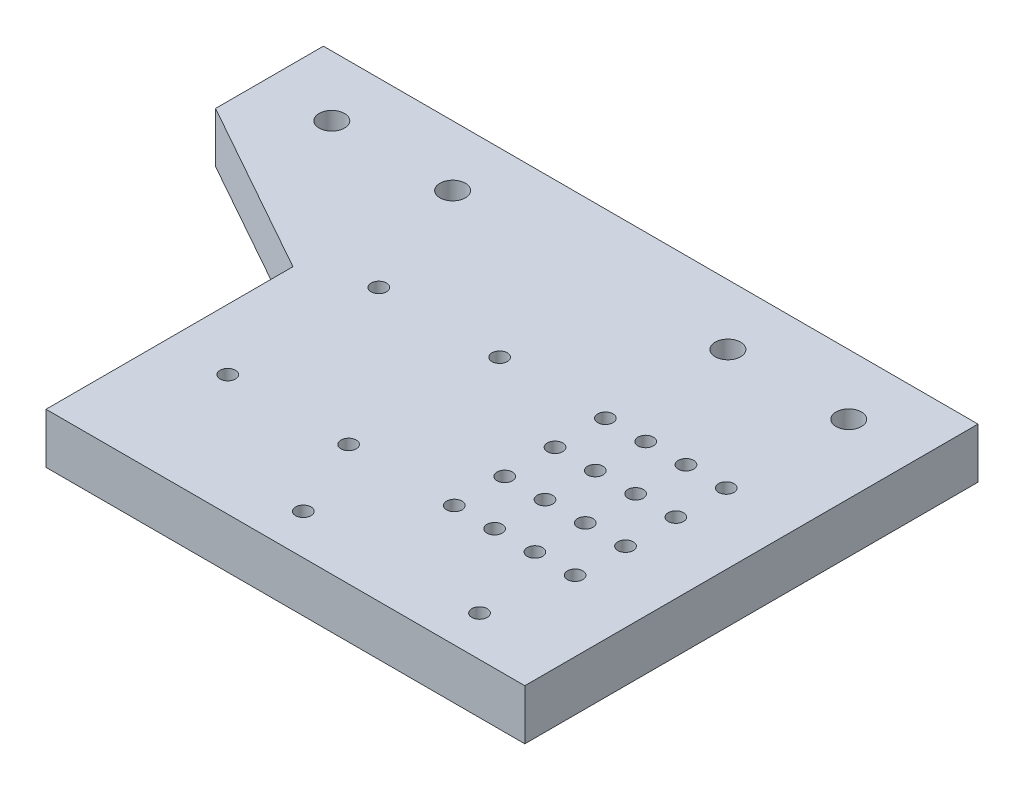
ISO-10303-21;
HEADER;
FILE_DESCRIPTION(('STEP AP214'),'2;1');
FILE_NAME('part.step','',(''),(''),'','','');
FILE_SCHEMA(('AUTOMOTIVE_DESIGN { 1 0 10303 214 1 1 1 1 }'));
ENDSEC;
DATA;
#1=APPLICATION_CONTEXT('core data for automotive mechanical design processes');
#2=APPLICATION_PROTOCOL_DEFINITION('international standard','automotive_design',2000,#1);
#3=PRODUCT_CONTEXT('',#1,'mechanical');
#4=PRODUCT('Part','Part','',(#3));
#5=PRODUCT_RELATED_PRODUCT_CATEGORY('part','',(#4));
#6=PRODUCT_DEFINITION_FORMATION('','',#4);
#7=PRODUCT_DEFINITION_CONTEXT('part definition',#1,'design');
#8=PRODUCT_DEFINITION('design','',#6,#7);
#9=PRODUCT_DEFINITION_SHAPE('','',#8);
#10=(LENGTH_UNIT() NAMED_UNIT(*) SI_UNIT(.MILLI.,.METRE.));
#11=(NAMED_UNIT(*) PLANE_ANGLE_UNIT() SI_UNIT($,.RADIAN.));
#12=(NAMED_UNIT(*) SI_UNIT($,.STERADIAN.) SOLID_ANGLE_UNIT());
#13=UNCERTAINTY_MEASURE_WITH_UNIT(LENGTH_MEASURE(1.E-05),#10,'distance_accuracy_value','');
#14=(GEOMETRIC_REPRESENTATION_CONTEXT(3) GLOBAL_UNCERTAINTY_ASSIGNED_CONTEXT((#13)) GLOBAL_UNIT_ASSIGNED_CONTEXT((#10,
#11,#12)) REPRESENTATION_CONTEXT('',''));
#15=CARTESIAN_POINT('',(0.,0.,0.));
#16=DIRECTION('',(0.,0.,1.));
#17=DIRECTION('',(1.,0.,0.));
#18=AXIS2_PLACEMENT_3D('',#15,#16,#17);
#19=CARTESIAN_POINT('',(0.,10.,17.2036231463069));
#20=DIRECTION('',(0.,0.,-1.));
#21=DIRECTION('',(-1.,0.,0.));
#22=AXIS2_PLACEMENT_3D('',#19,#20,#21);
#23=PLANE('',#22);
#24=DIRECTION('',(1.,0.,0.));
#25=VECTOR('',#24,1.);
#26=CARTESIAN_POINT('',(0.,0.,17.2036231463069));
#27=LINE('',#26,#25);
#28=CARTESIAN_POINT('',(-63.3580950062037,0.,17.2036231463069));
#29=VERTEX_POINT('',#28);
#30=CARTESIAN_POINT('',(31.7389236170605,0.,17.2036231463069));
#31=VERTEX_POINT('',#30);
#32=EDGE_CURVE('E223',#29,#31,#27,.T.);
#33=ORIENTED_EDGE('',*,*,#32,.T.);
#34=DIRECTION('',(0.,-1.,0.));
#35=VECTOR('',#34,1.);
#36=CARTESIAN_POINT('',(31.7389236170605,10.,17.2036231463069));
#37=LINE('',#36,#35);
#38=CARTESIAN_POINT('',(31.7389236170605,10.,17.2036231463069));
#39=VERTEX_POINT('',#38);
#40=EDGE_CURVE('E12',#39,#31,#37,.T.);
#41=ORIENTED_EDGE('',*,*,#40,.F.);
#42=DIRECTION('',(1.,0.,0.));
#43=VECTOR('',#42,1.);
#44=CARTESIAN_POINT('',(0.,10.,17.2036231463069));
#45=LINE('',#44,#43);
#46=CARTESIAN_POINT('',(-63.3580950062037,10.,17.2036231463069));
#47=VERTEX_POINT('',#46);
#48=EDGE_CURVE('E89',#47,#39,#45,.T.);
#49=ORIENTED_EDGE('',*,*,#48,.F.);
#50=DIRECTION('',(0.,-1.,0.));
#51=VECTOR('',#50,1.);
#52=CARTESIAN_POINT('',(-63.3580950062037,10.,17.2036231463069));
#53=LINE('',#52,#51);
#54=EDGE_CURVE('E168',#47,#29,#53,.T.);
#55=ORIENTED_EDGE('',*,*,#54,.T.);
#56=EDGE_LOOP('',(#33,#41,#49,#55));
#57=FACE_BOUND('',#56,.T.);
#58=ADVANCED_FACE('F38',(#57),#23,.F.);
#59=CARTESIAN_POINT('',(31.7389236170605,10.,0.));
#60=DIRECTION('',(1.,0.,0.));
#61=DIRECTION('',(0.,0.,-1.));
#62=AXIS2_PLACEMENT_3D('',#59,#60,#61);
#63=PLANE('',#62);
#64=DIRECTION('',(0.,0.,1.));
#65=VECTOR('',#64,1.);
#66=CARTESIAN_POINT('',(31.7389236170605,0.,0.));
#67=LINE('',#66,#65);
#68=CARTESIAN_POINT('',(31.7389236170605,0.,-72.7963768536931));
#69=VERTEX_POINT('',#68);
#70=EDGE_CURVE('E226',#69,#31,#67,.T.);
#71=ORIENTED_EDGE('',*,*,#70,.F.);
#72=DIRECTION('',(0.,-1.,0.));
#73=VECTOR('',#72,1.);
#74=CARTESIAN_POINT('',(31.7389236170605,10.,-72.7963768536931));
#75=LINE('',#74,#73);
#76=CARTESIAN_POINT('',(31.7389236170605,10.,-72.7963768536931));
#77=VERTEX_POINT('',#76);
#78=EDGE_CURVE('E47',#77,#69,#75,.T.);
#79=ORIENTED_EDGE('',*,*,#78,.F.);
#80=DIRECTION('',(0.,0.,1.));
#81=VECTOR('',#80,1.);
#82=CARTESIAN_POINT('',(31.7389236170605,10.,0.));
#83=LINE('',#82,#81);
#84=EDGE_CURVE('E862',#77,#39,#83,.T.);
#85=ORIENTED_EDGE('',*,*,#84,.T.);
#86=ORIENTED_EDGE('',*,*,#40,.T.);
#87=EDGE_LOOP('',(#71,#79,#85,#86));
#88=FACE_BOUND('',#87,.T.);
#89=ADVANCED_FACE('F268',(#88),#63,.T.);
#90=CARTESIAN_POINT('',(0.,10.,-72.7963768536931));
#91=DIRECTION('',(0.,0.,-1.));
#92=DIRECTION('',(-1.,0.,0.));
#93=AXIS2_PLACEMENT_3D('',#90,#91,#92);
#94=PLANE('',#93);
#95=DIRECTION('',(1.,0.,0.));
#96=VECTOR('',#95,1.);
#97=CARTESIAN_POINT('',(0.,0.,-72.7963768536931));
#98=LINE('',#97,#96);
#99=CARTESIAN_POINT('',(-98.2610763829395,0.,-72.7963768536931));
#100=VERTEX_POINT('',#99);
#101=EDGE_CURVE('E229',#100,#69,#98,.T.);
#102=ORIENTED_EDGE('',*,*,#101,.F.);
#103=DIRECTION('',(0.,-1.,0.));
#104=VECTOR('',#103,1.);
#105=CARTESIAN_POINT('',(-98.2610763829395,10.,-72.7963768536931));
#106=LINE('',#105,#104);
#107=CARTESIAN_POINT('',(-98.2610763829395,10.,-72.7963768536931));
#108=VERTEX_POINT('',#107);
#109=EDGE_CURVE('E114',#108,#100,#106,.T.);
#110=ORIENTED_EDGE('',*,*,#109,.F.);
#111=DIRECTION('',(1.,0.,0.));
#112=VECTOR('',#111,1.);
#113=CARTESIAN_POINT('',(0.,10.,-72.7963768536931));
#114=LINE('',#113,#112);
#115=EDGE_CURVE('E106',#108,#77,#114,.T.);
#116=ORIENTED_EDGE('',*,*,#115,.T.);
#117=ORIENTED_EDGE('',*,*,#78,.T.);
#118=EDGE_LOOP('',(#102,#110,#116,#117));
#119=FACE_BOUND('',#118,.T.);
#120=ADVANCED_FACE('F265',(#119),#94,.T.);
#121=CARTESIAN_POINT('',(-98.2610763829395,10.,0.));
#122=DIRECTION('',(1.,0.,0.));
#123=DIRECTION('',(0.,0.,-1.));
#124=AXIS2_PLACEMENT_3D('',#121,#122,#123);
#125=PLANE('',#124);
#126=DIRECTION('',(0.,0.,1.));
#127=VECTOR('',#126,1.);
#128=CARTESIAN_POINT('',(-98.2610763829395,0.,0.));
#129=LINE('',#128,#127);
#130=CARTESIAN_POINT('',(-98.2610763829395,0.,-51.3710297041461));
#131=VERTEX_POINT('',#130);
#132=EDGE_CURVE('E113',#100,#131,#129,.T.);
#133=ORIENTED_EDGE('',*,*,#132,.T.);
#134=DIRECTION('',(0.,-1.,0.));
#135=VECTOR('',#134,1.);
#136=CARTESIAN_POINT('',(-98.2610763829395,10.,-51.3710297041461));
#137=LINE('',#136,#135);
#138=CARTESIAN_POINT('',(-98.2610763829395,10.,-51.3710297041461));
#139=VERTEX_POINT('',#138);
#140=EDGE_CURVE('E110',#139,#131,#137,.T.);
#141=ORIENTED_EDGE('',*,*,#140,.F.);
#142=DIRECTION('',(0.,0.,1.));
#143=VECTOR('',#142,1.);
#144=CARTESIAN_POINT('',(-98.2610763829395,10.,0.));
#145=LINE('',#144,#143);
#146=EDGE_CURVE('E99',#108,#139,#145,.T.);
#147=ORIENTED_EDGE('',*,*,#146,.F.);
#148=ORIENTED_EDGE('',*,*,#109,.T.);
#149=EDGE_LOOP('',(#133,#141,#147,#148));
#150=FACE_BOUND('',#149,.T.);
#151=ADVANCED_FACE('F111',(#150),#125,.F.);
#152=CARTESIAN_POINT('',(-1.53993049672828,10.,2.75195190297999));
#153=DIRECTION('',(0.488322696033954,0.,-0.872663133481718));
#154=DIRECTION('',(-0.872663133481718,0.,-0.488322696033954));
#155=AXIS2_PLACEMENT_3D('',#152,#153,#154);
#156=PLANE('',#155);
#157=DIRECTION('',(0.872663133481718,0.,0.488322696033954));
#158=VECTOR('',#157,1.);
#159=CARTESIAN_POINT('',(-1.53993049672828,0.,2.75195190297999));
#160=LINE('',#159,#158);
#161=CARTESIAN_POINT('',(-63.3580950062037,0.,-31.8401049846506));
#162=VERTEX_POINT('',#161);
#163=EDGE_CURVE('E77',#131,#162,#160,.T.);
#164=ORIENTED_EDGE('',*,*,#163,.T.);
#165=DIRECTION('',(0.,-1.,0.));
#166=VECTOR('',#165,1.);
#167=CARTESIAN_POINT('',(-63.3580950062037,10.,-31.8401049846506));
#168=LINE('',#167,#166);
#169=CARTESIAN_POINT('',(-63.3580950062037,10.,-31.8401049846506));
#170=VERTEX_POINT('',#169);
#171=EDGE_CURVE('E115',#170,#162,#168,.T.);
#172=ORIENTED_EDGE('',*,*,#171,.F.);
#173=DIRECTION('',(0.872663133481718,0.,0.488322696033954));
#174=VECTOR('',#173,1.);
#175=CARTESIAN_POINT('',(-1.53993049672828,10.,2.75195190297999));
#176=LINE('',#175,#174);
#177=EDGE_CURVE('E104',#139,#170,#176,.T.);
#178=ORIENTED_EDGE('',*,*,#177,.F.);
#179=ORIENTED_EDGE('',*,*,#140,.T.);
#180=EDGE_LOOP('',(#164,#172,#178,#179));
#181=FACE_BOUND('',#180,.T.);
#182=ADVANCED_FACE('F117',(#181),#156,.F.);
#183=CARTESIAN_POINT('',(9.7365771203231,10.,-16.7963768536931));
#184=DIRECTION('',(0.,-1.,0.));
#185=DIRECTION('',(0.,0.,-1.));
#186=AXIS2_PLACEMENT_3D('',#183,#184,#185);
#187=CYLINDRICAL_SURFACE('',#186,1.525);
#188=CARTESIAN_POINT('',(9.7365771203231,10.,-16.7963768536931));
#189=DIRECTION('',(0.,1.,0.));
#190=DIRECTION('',(0.,0.,1.));
#191=AXIS2_PLACEMENT_3D('',#188,#189,#190);
#192=CIRCLE('',#191,1.525);
#193=CARTESIAN_POINT('',(9.7365771203231,10.,-15.2713768536931));
#194=VERTEX_POINT('',#193);
#195=EDGE_CURVE('E160',#194,#194,#192,.F.);
#196=ORIENTED_EDGE('',*,*,#195,.F.);
#197=EDGE_LOOP('',(#196));
#198=FACE_BOUND('',#197,.T.);
#199=CARTESIAN_POINT('',(9.7365771203231,0.,-16.7963768536931));
#200=DIRECTION('',(0.,1.,0.));
#201=DIRECTION('',(0.,0.,1.));
#202=AXIS2_PLACEMENT_3D('',#199,#200,#201);
#203=CIRCLE('',#202,1.525);
#204=CARTESIAN_POINT('',(9.7365771203231,0.,-15.2713768536931));
#205=VERTEX_POINT('',#204);
#206=EDGE_CURVE('E253',#205,#205,#203,.F.);
#207=ORIENTED_EDGE('',*,*,#206,.T.);
#208=EDGE_LOOP('',(#207));
#209=FACE_BOUND('',#208,.T.);
#210=ADVANCED_FACE('F430',(#198,#209),#187,.F.);
#211=CARTESIAN_POINT('',(17.7389236170605,10.,-36.7963768536931));
#212=DIRECTION('',(0.,-1.,0.));
#213=DIRECTION('',(0.,0.,-1.));
#214=AXIS2_PLACEMENT_3D('',#211,#212,#213);
#215=CYLINDRICAL_SURFACE('',#214,1.525);
#216=CARTESIAN_POINT('',(17.7389236170605,10.,-36.7963768536931));
#217=DIRECTION('',(0.,1.,0.));
#218=DIRECTION('',(0.,0.,1.));
#219=AXIS2_PLACEMENT_3D('',#216,#217,#218);
#220=CIRCLE('',#219,1.525);
#221=CARTESIAN_POINT('',(17.7389236170605,10.,-35.2713768536931));
#222=VERTEX_POINT('',#221);
#223=EDGE_CURVE('E155',#222,#222,#220,.T.);
#224=ORIENTED_EDGE('',*,*,#223,.T.);
#225=EDGE_LOOP('',(#224));
#226=FACE_BOUND('',#225,.T.);
#227=CARTESIAN_POINT('',(17.7389236170605,0.,-36.7963768536931));
#228=DIRECTION('',(0.,1.,0.));
#229=DIRECTION('',(0.,0.,1.));
#230=AXIS2_PLACEMENT_3D('',#227,#228,#229);
#231=CIRCLE('',#230,1.525);
#232=CARTESIAN_POINT('',(17.7389236170605,0.,-35.2713768536931));
#233=VERTEX_POINT('',#232);
#234=EDGE_CURVE('E250',#233,#233,#231,.T.);
#235=ORIENTED_EDGE('',*,*,#234,.F.);
#236=EDGE_LOOP('',(#235));
#237=FACE_BOUND('',#236,.T.);
#238=ADVANCED_FACE('F433',(#226,#237),#215,.F.);
#239=CARTESIAN_POINT('',(-60.5943040819661,10.,-60.7963768536931));
#240=DIRECTION('',(0.,-1.,0.));
#241=DIRECTION('',(0.,0.,-1.));
#242=AXIS2_PLACEMENT_3D('',#239,#240,#241);
#243=CYLINDRICAL_SURFACE('',#242,2.525);
#244=CARTESIAN_POINT('',(-60.5943040819661,10.,-60.7963768536931));
#245=DIRECTION('',(0.,1.,0.));
#246=DIRECTION('',(0.,0.,1.));
#247=AXIS2_PLACEMENT_3D('',#244,#245,#246);
#248=CIRCLE('',#247,2.525);
#249=CARTESIAN_POINT('',(-60.5943040819661,10.,-58.2713768536931));
#250=VERTEX_POINT('',#249);
#251=EDGE_CURVE('E152',#250,#250,#248,.F.);
#252=ORIENTED_EDGE('',*,*,#251,.F.);
#253=EDGE_LOOP('',(#252));
#254=FACE_BOUND('',#253,.T.);
#255=CARTESIAN_POINT('',(-60.5943040819661,0.,-60.7963768536931));
#256=DIRECTION('',(0.,1.,0.));
#257=DIRECTION('',(0.,0.,1.));
#258=AXIS2_PLACEMENT_3D('',#255,#256,#257);
#259=CIRCLE('',#258,2.525);
#260=CARTESIAN_POINT('',(-60.5943040819661,0.,-58.2713768536931));
#261=VERTEX_POINT('',#260);
#262=EDGE_CURVE('E247',#261,#261,#259,.F.);
#263=ORIENTED_EDGE('',*,*,#262,.T.);
#264=EDGE_LOOP('',(#263));
#265=FACE_BOUND('',#264,.T.);
#266=ADVANCED_FACE('F437',(#254,#265),#243,.F.);
#267=CARTESIAN_POINT('',(-84.5943040819661,10.,-60.7963768536931));
#268=DIRECTION('',(0.,-1.,0.));
#269=DIRECTION('',(0.,0.,-1.));
#270=AXIS2_PLACEMENT_3D('',#267,#268,#269);
#271=CYLINDRICAL_SURFACE('',#270,2.52500000000001);
#272=CARTESIAN_POINT('',(-84.5943040819661,10.,-60.7963768536931));
#273=DIRECTION('',(0.,1.,0.));
#274=DIRECTION('',(0.,0.,1.));
#275=AXIS2_PLACEMENT_3D('',#272,#273,#274);
#276=CIRCLE('',#275,2.52500000000001);
#277=CARTESIAN_POINT('',(-84.5943040819661,10.,-58.2713768536931));
#278=VERTEX_POINT('',#277);
#279=EDGE_CURVE('E148',#278,#278,#276,.F.);
#280=ORIENTED_EDGE('',*,*,#279,.F.);
#281=EDGE_LOOP('',(#280));
#282=FACE_BOUND('',#281,.T.);
#283=CARTESIAN_POINT('',(-84.5943040819661,0.,-60.7963768536931));
#284=DIRECTION('',(0.,1.,0.));
#285=DIRECTION('',(0.,0.,1.));
#286=AXIS2_PLACEMENT_3D('',#283,#284,#285);
#287=CIRCLE('',#286,2.52500000000001);
#288=CARTESIAN_POINT('',(-84.5943040819661,0.,-58.2713768536931));
#289=VERTEX_POINT('',#288);
#290=EDGE_CURVE('E244',#289,#289,#287,.F.);
#291=ORIENTED_EDGE('',*,*,#290,.T.);
#292=EDGE_LOOP('',(#291));
#293=FACE_BOUND('',#292,.T.);
#294=ADVANCED_FACE('F441',(#282,#293),#271,.F.);
#295=CARTESIAN_POINT('',(-51.2610763829395,10.,-36.7963768536931));
#296=DIRECTION('',(0.,-1.,0.));
#297=DIRECTION('',(0.,0.,-1.));
#298=AXIS2_PLACEMENT_3D('',#295,#296,#297);
#299=CYLINDRICAL_SURFACE('',#298,1.525);
#300=CARTESIAN_POINT('',(-51.2610763829395,10.,-36.7963768536931));
#301=DIRECTION('',(0.,1.,0.));
#302=DIRECTION('',(0.,0.,1.));
#303=AXIS2_PLACEMENT_3D('',#300,#301,#302);
#304=CIRCLE('',#303,1.525);
#305=CARTESIAN_POINT('',(-51.2610763829395,10.,-35.2713768536931));
#306=VERTEX_POINT('',#305);
#307=EDGE_CURVE('E143',#306,#306,#304,.T.);
#308=ORIENTED_EDGE('',*,*,#307,.T.);
#309=EDGE_LOOP('',(#308));
#310=FACE_BOUND('',#309,.T.);
#311=CARTESIAN_POINT('',(-51.2610763829395,0.,-36.7963768536931));
#312=DIRECTION('',(0.,1.,0.));
#313=DIRECTION('',(0.,0.,1.));
#314=AXIS2_PLACEMENT_3D('',#311,#312,#313);
#315=CIRCLE('',#314,1.525);
#316=CARTESIAN_POINT('',(-51.2610763829395,0.,-35.2713768536931));
#317=VERTEX_POINT('',#316);
#318=EDGE_CURVE('E241',#317,#317,#315,.T.);
#319=ORIENTED_EDGE('',*,*,#318,.F.);
#320=EDGE_LOOP('',(#319));
#321=FACE_BOUND('',#320,.T.);
#322=ADVANCED_FACE('F445',(#310,#321),#299,.F.);
#323=CARTESIAN_POINT('',(-20.2610763829395,10.,9.20362314630692));
#324=DIRECTION('',(0.,-1.,0.));
#325=DIRECTION('',(0.,0.,-1.));
#326=AXIS2_PLACEMENT_3D('',#323,#324,#325);
#327=CYLINDRICAL_SURFACE('',#326,1.525);
#328=CARTESIAN_POINT('',(-20.2610763829395,10.,9.20362314630692));
#329=DIRECTION('',(0.,1.,0.));
#330=DIRECTION('',(0.,0.,1.));
#331=AXIS2_PLACEMENT_3D('',#328,#329,#330);
#332=CIRCLE('',#331,1.525);
#333=CARTESIAN_POINT('',(-20.2610763829395,10.,10.7286231463069));
#334=VERTEX_POINT('',#333);
#335=EDGE_CURVE('E138',#334,#334,#332,.T.);
#336=ORIENTED_EDGE('',*,*,#335,.T.);
#337=EDGE_LOOP('',(#336));
#338=FACE_BOUND('',#337,.T.);
#339=CARTESIAN_POINT('',(-20.2610763829395,0.,9.20362314630692));
#340=DIRECTION('',(0.,1.,0.));
#341=DIRECTION('',(0.,0.,1.));
#342=AXIS2_PLACEMENT_3D('',#339,#340,#341);
#343=CIRCLE('',#342,1.525);
#344=CARTESIAN_POINT('',(-20.2610763829395,0.,10.7286231463069));
#345=VERTEX_POINT('',#344);
#346=EDGE_CURVE('E238',#345,#345,#343,.T.);
#347=ORIENTED_EDGE('',*,*,#346,.F.);
#348=EDGE_LOOP('',(#347));
#349=FACE_BOUND('',#348,.T.);
#350=ADVANCED_FACE('F286',(#338,#349),#327,.F.);
#351=CARTESIAN_POINT('',(-5.927848683913,10.,-60.7963768536931));
#352=DIRECTION('',(0.,-1.,0.));
#353=DIRECTION('',(0.,0.,-1.));
#354=AXIS2_PLACEMENT_3D('',#351,#352,#353);
#355=CYLINDRICAL_SURFACE('',#354,2.525);
#356=CARTESIAN_POINT('',(-5.927848683913,10.,-60.7963768536931));
#357=DIRECTION('',(0.,1.,0.));
#358=DIRECTION('',(0.,0.,1.));
#359=AXIS2_PLACEMENT_3D('',#356,#357,#358);
#360=CIRCLE('',#359,2.525);
#361=CARTESIAN_POINT('',(-5.927848683913,10.,-58.2713768536931));
#362=VERTEX_POINT('',#361);
#363=EDGE_CURVE('E121',#362,#362,#360,.T.);
#364=ORIENTED_EDGE('',*,*,#363,.T.);
#365=EDGE_LOOP('',(#364));
#366=FACE_BOUND('',#365,.T.);
#367=CARTESIAN_POINT('',(-5.927848683913,0.,-60.7963768536931));
#368=DIRECTION('',(0.,1.,0.));
#369=DIRECTION('',(0.,0.,1.));
#370=AXIS2_PLACEMENT_3D('',#367,#368,#369);
#371=CIRCLE('',#370,2.525);
#372=CARTESIAN_POINT('',(-5.927848683913,0.,-58.2713768536931));
#373=VERTEX_POINT('',#372);
#374=EDGE_CURVE('E235',#373,#373,#371,.T.);
#375=ORIENTED_EDGE('',*,*,#374,.F.);
#376=EDGE_LOOP('',(#375));
#377=FACE_BOUND('',#376,.T.);
#378=ADVANCED_FACE('F277',(#366,#377),#355,.F.);
#379=CARTESIAN_POINT('',(-63.3580950062037,10.,0.));
#380=DIRECTION('',(1.,0.,0.));
#381=DIRECTION('',(0.,0.,-1.));
#382=AXIS2_PLACEMENT_3D('',#379,#380,#381);
#383=PLANE('',#382);
#384=DIRECTION('',(0.,0.,1.));
#385=VECTOR('',#384,1.);
#386=CARTESIAN_POINT('',(-63.3580950062037,0.,0.));
#387=LINE('',#386,#385);
#388=EDGE_CURVE('E83',#162,#29,#387,.T.);
#389=ORIENTED_EDGE('',*,*,#388,.T.);
#390=ORIENTED_EDGE('',*,*,#54,.F.);
#391=DIRECTION('',(0.,0.,1.));
#392=VECTOR('',#391,1.);
#393=CARTESIAN_POINT('',(-63.3580950062037,10.,0.));
#394=LINE('',#393,#392);
#395=EDGE_CURVE('E55',#170,#47,#394,.T.);
#396=ORIENTED_EDGE('',*,*,#395,.F.);
#397=ORIENTED_EDGE('',*,*,#171,.T.);
#398=EDGE_LOOP('',(#389,#390,#396,#397));
#399=FACE_BOUND('',#398,.T.);
#400=ADVANCED_FACE('F274',(#399),#383,.F.);
#401=CARTESIAN_POINT('',(-51.2610763829395,10.,-6.79637685369309));
#402=DIRECTION('',(0.,-1.,0.));
#403=DIRECTION('',(0.,0.,-1.));
#404=AXIS2_PLACEMENT_3D('',#401,#402,#403);
#405=CYLINDRICAL_SURFACE('',#404,1.525);
#406=CARTESIAN_POINT('',(-51.2610763829395,10.,-6.79637685369309));
#407=DIRECTION('',(0.,1.,0.));
#408=DIRECTION('',(0.,0.,1.));
#409=AXIS2_PLACEMENT_3D('',#406,#407,#408);
#410=CIRCLE('',#409,1.525);
#411=CARTESIAN_POINT('',(-51.2610763829395,10.,-5.27137685369309));
#412=VERTEX_POINT('',#411);
#413=EDGE_CURVE('E857',#412,#412,#410,.T.);
#414=ORIENTED_EDGE('',*,*,#413,.T.);
#415=EDGE_LOOP('',(#414));
#416=FACE_BOUND('',#415,.T.);
#417=CARTESIAN_POINT('',(-51.2610763829395,0.,-6.79637685369309));
#418=DIRECTION('',(0.,1.,0.));
#419=DIRECTION('',(0.,0.,1.));
#420=AXIS2_PLACEMENT_3D('',#417,#418,#419);
#421=CIRCLE('',#420,1.525);
#422=CARTESIAN_POINT('',(-51.2610763829395,0.,-5.27137685369309));
#423=VERTEX_POINT('',#422);
#424=EDGE_CURVE('E220',#423,#423,#421,.T.);
#425=ORIENTED_EDGE('',*,*,#424,.F.);
#426=EDGE_LOOP('',(#425));
#427=FACE_BOUND('',#426,.T.);
#428=ADVANCED_FACE('F276',(#416,#427),#405,.F.);
#429=CARTESIAN_POINT('',(-27.2610763829395,10.,-36.7963768536931));
#430=DIRECTION('',(0.,-1.,0.));
#431=DIRECTION('',(0.,0.,-1.));
#432=AXIS2_PLACEMENT_3D('',#429,#430,#431);
#433=CYLINDRICAL_SURFACE('',#432,1.52499999999999);
#434=CARTESIAN_POINT('',(-27.2610763829395,10.,-36.7963768536931));
#435=DIRECTION('',(0.,1.,0.));
#436=DIRECTION('',(0.,0.,1.));
#437=AXIS2_PLACEMENT_3D('',#434,#435,#436);
#438=CIRCLE('',#437,1.52499999999999);
#439=CARTESIAN_POINT('',(-27.2610763829395,10.,-35.2713768536931));
#440=VERTEX_POINT('',#439);
#441=EDGE_CURVE('E854',#440,#440,#438,.F.);
#442=ORIENTED_EDGE('',*,*,#441,.F.);
#443=EDGE_LOOP('',(#442));
#444=FACE_BOUND('',#443,.T.);
#445=CARTESIAN_POINT('',(-27.2610763829395,0.,-36.7963768536931));
#446=DIRECTION('',(0.,1.,0.));
#447=DIRECTION('',(0.,0.,1.));
#448=AXIS2_PLACEMENT_3D('',#445,#446,#447);
#449=CIRCLE('',#448,1.52499999999999);
#450=CARTESIAN_POINT('',(-27.2610763829395,0.,-35.2713768536931));
#451=VERTEX_POINT('',#450);
#452=EDGE_CURVE('E217',#451,#451,#449,.F.);
#453=ORIENTED_EDGE('',*,*,#452,.T.);
#454=EDGE_LOOP('',(#453));
#455=FACE_BOUND('',#454,.T.);
#456=ADVANCED_FACE('F283',(#444,#455),#433,.F.);
#457=CARTESIAN_POINT('',(-27.2610763829395,10.,-6.79637685369309));
#458=DIRECTION('',(0.,-1.,0.));
#459=DIRECTION('',(0.,0.,-1.));
#460=AXIS2_PLACEMENT_3D('',#457,#458,#459);
#461=CYLINDRICAL_SURFACE('',#460,1.525);
#462=CARTESIAN_POINT('',(-27.2610763829395,10.,-6.79637685369309));
#463=DIRECTION('',(0.,1.,0.));
#464=DIRECTION('',(0.,0.,1.));
#465=AXIS2_PLACEMENT_3D('',#462,#463,#464);
#466=CIRCLE('',#465,1.525);
#467=CARTESIAN_POINT('',(-27.2610763829395,10.,-5.27137685369309));
#468=VERTEX_POINT('',#467);
#469=EDGE_CURVE('E850',#468,#468,#466,.F.);
#470=ORIENTED_EDGE('',*,*,#469,.F.);
#471=EDGE_LOOP('',(#470));
#472=FACE_BOUND('',#471,.T.);
#473=CARTESIAN_POINT('',(-27.2610763829395,0.,-6.79637685369309));
#474=DIRECTION('',(0.,1.,0.));
#475=DIRECTION('',(0.,0.,1.));
#476=AXIS2_PLACEMENT_3D('',#473,#474,#475);
#477=CIRCLE('',#476,1.525);
#478=CARTESIAN_POINT('',(-27.2610763829395,0.,-5.27137685369309));
#479=VERTEX_POINT('',#478);
#480=EDGE_CURVE('E214',#479,#479,#477,.F.);
#481=ORIENTED_EDGE('',*,*,#480,.T.);
#482=EDGE_LOOP('',(#481));
#483=FACE_BOUND('',#482,.T.);
#484=ADVANCED_FACE('F300',(#472,#483),#461,.F.);
#485=CARTESIAN_POINT('',(-6.26107638293954,10.,-36.7963768536931));
#486=DIRECTION('',(0.,-1.,0.));
#487=DIRECTION('',(0.,0.,-1.));
#488=AXIS2_PLACEMENT_3D('',#485,#486,#487);
#489=CYLINDRICAL_SURFACE('',#488,1.525);
#490=CARTESIAN_POINT('',(-6.26107638293954,10.,-36.7963768536931));
#491=DIRECTION('',(0.,1.,0.));
#492=DIRECTION('',(0.,0.,1.));
#493=AXIS2_PLACEMENT_3D('',#490,#491,#492);
#494=CIRCLE('',#493,1.525);
#495=CARTESIAN_POINT('',(-6.26107638293954,10.,-35.2713768536931));
#496=VERTEX_POINT('',#495);
#497=EDGE_CURVE('E846',#496,#496,#494,.T.);
#498=ORIENTED_EDGE('',*,*,#497,.T.);
#499=EDGE_LOOP('',(#498));
#500=FACE_BOUND('',#499,.T.);
#501=CARTESIAN_POINT('',(-6.26107638293954,0.,-36.7963768536931));
#502=DIRECTION('',(0.,1.,0.));
#503=DIRECTION('',(0.,0.,1.));
#504=AXIS2_PLACEMENT_3D('',#501,#502,#503);
#505=CIRCLE('',#504,1.525);
#506=CARTESIAN_POINT('',(-6.26107638293954,0.,-35.2713768536931));
#507=VERTEX_POINT('',#506);
#508=EDGE_CURVE('E211',#507,#507,#505,.T.);
#509=ORIENTED_EDGE('',*,*,#508,.F.);
#510=EDGE_LOOP('',(#509));
#511=FACE_BOUND('',#510,.T.);
#512=ADVANCED_FACE('F304',(#500,#511),#489,.F.);
#513=CARTESIAN_POINT('',(-6.26107638293954,10.,-16.7963768536931));
#514=DIRECTION('',(0.,-1.,0.));
#515=DIRECTION('',(0.,0.,-1.));
#516=AXIS2_PLACEMENT_3D('',#513,#514,#515);
#517=CYLINDRICAL_SURFACE('',#516,1.525);
#518=CARTESIAN_POINT('',(-6.26107638293954,10.,-16.7963768536931));
#519=DIRECTION('',(0.,1.,0.));
#520=DIRECTION('',(0.,0.,1.));
#521=AXIS2_PLACEMENT_3D('',#518,#519,#520);
#522=CIRCLE('',#521,1.525);
#523=CARTESIAN_POINT('',(-6.26107638293954,10.,-15.2713768536931));
#524=VERTEX_POINT('',#523);
#525=EDGE_CURVE('E842',#524,#524,#522,.T.);
#526=ORIENTED_EDGE('',*,*,#525,.T.);
#527=EDGE_LOOP('',(#526));
#528=FACE_BOUND('',#527,.T.);
#529=CARTESIAN_POINT('',(-6.26107638293954,0.,-16.7963768536931));
#530=DIRECTION('',(0.,1.,0.));
#531=DIRECTION('',(0.,0.,1.));
#532=AXIS2_PLACEMENT_3D('',#529,#530,#531);
#533=CIRCLE('',#532,1.525);
#534=CARTESIAN_POINT('',(-6.26107638293954,0.,-15.2713768536931));
#535=VERTEX_POINT('',#534);
#536=EDGE_CURVE('E208',#535,#535,#533,.T.);
#537=ORIENTED_EDGE('',*,*,#536,.F.);
#538=EDGE_LOOP('',(#537));
#539=FACE_BOUND('',#538,.T.);
#540=ADVANCED_FACE('F308',(#528,#539),#517,.F.);
#541=CARTESIAN_POINT('',(-6.26107638293954,10.,-6.79637685369309));
#542=DIRECTION('',(0.,-1.,0.));
#543=DIRECTION('',(0.,0.,-1.));
#544=AXIS2_PLACEMENT_3D('',#541,#542,#543);
#545=CYLINDRICAL_SURFACE('',#544,1.525);
#546=CARTESIAN_POINT('',(-6.26107638293954,10.,-6.79637685369309));
#547=DIRECTION('',(0.,1.,0.));
#548=DIRECTION('',(0.,0.,1.));
#549=AXIS2_PLACEMENT_3D('',#546,#547,#548);
#550=CIRCLE('',#549,1.525);
#551=CARTESIAN_POINT('',(-6.26107638293954,10.,-5.27137685369308));
#552=VERTEX_POINT('',#551);
#553=EDGE_CURVE('E838',#552,#552,#550,.T.);
#554=ORIENTED_EDGE('',*,*,#553,.T.);
#555=EDGE_LOOP('',(#554));
#556=FACE_BOUND('',#555,.T.);
#557=CARTESIAN_POINT('',(-6.26107638293954,0.,-6.79637685369309));
#558=DIRECTION('',(0.,1.,0.));
#559=DIRECTION('',(0.,0.,1.));
#560=AXIS2_PLACEMENT_3D('',#557,#558,#559);
#561=CIRCLE('',#560,1.525);
#562=CARTESIAN_POINT('',(-6.26107638293954,0.,-5.27137685369308));
#563=VERTEX_POINT('',#562);
#564=EDGE_CURVE('E205',#563,#563,#561,.T.);
#565=ORIENTED_EDGE('',*,*,#564,.F.);
#566=EDGE_LOOP('',(#565));
#567=FACE_BOUND('',#566,.T.);
#568=ADVANCED_FACE('F312',(#556,#567),#545,.F.);
#569=CARTESIAN_POINT('',(1.7365771203231,10.,-6.79637685369308));
#570=DIRECTION('',(0.,-1.,0.));
#571=DIRECTION('',(0.,0.,-1.));
#572=AXIS2_PLACEMENT_3D('',#569,#570,#571);
#573=CYLINDRICAL_SURFACE('',#572,1.525);
#574=CARTESIAN_POINT('',(1.7365771203231,10.,-6.79637685369308));
#575=DIRECTION('',(0.,1.,0.));
#576=DIRECTION('',(0.,0.,1.));
#577=AXIS2_PLACEMENT_3D('',#574,#575,#576);
#578=CIRCLE('',#577,1.525);
#579=CARTESIAN_POINT('',(1.7365771203231,10.,-5.27137685369309));
#580=VERTEX_POINT('',#579);
#581=EDGE_CURVE('E834',#580,#580,#578,.F.);
#582=ORIENTED_EDGE('',*,*,#581,.F.);
#583=EDGE_LOOP('',(#582));
#584=FACE_BOUND('',#583,.T.);
#585=CARTESIAN_POINT('',(1.7365771203231,0.,-6.79637685369308));
#586=DIRECTION('',(0.,1.,0.));
#587=DIRECTION('',(0.,0.,1.));
#588=AXIS2_PLACEMENT_3D('',#585,#586,#587);
#589=CIRCLE('',#588,1.525);
#590=CARTESIAN_POINT('',(1.7365771203231,0.,-5.27137685369309));
#591=VERTEX_POINT('',#590);
#592=EDGE_CURVE('E202',#591,#591,#589,.F.);
#593=ORIENTED_EDGE('',*,*,#592,.T.);
#594=EDGE_LOOP('',(#593));
#595=FACE_BOUND('',#594,.T.);
#596=ADVANCED_FACE('F316',(#584,#595),#573,.F.);
#597=CARTESIAN_POINT('',(9.73657712032309,10.,-6.79637685369309));
#598=DIRECTION('',(0.,-1.,0.));
#599=DIRECTION('',(0.,0.,-1.));
#600=AXIS2_PLACEMENT_3D('',#597,#598,#599);
#601=CYLINDRICAL_SURFACE('',#600,1.525);
#602=CARTESIAN_POINT('',(9.73657712032309,10.,-6.79637685369309));
#603=DIRECTION('',(0.,1.,0.));
#604=DIRECTION('',(0.,0.,1.));
#605=AXIS2_PLACEMENT_3D('',#602,#603,#604);
#606=CIRCLE('',#605,1.525);
#607=CARTESIAN_POINT('',(9.73657712032309,10.,-5.27137685369309));
#608=VERTEX_POINT('',#607);
#609=EDGE_CURVE('E830',#608,#608,#606,.F.);
#610=ORIENTED_EDGE('',*,*,#609,.F.);
#611=EDGE_LOOP('',(#610));
#612=FACE_BOUND('',#611,.T.);
#613=CARTESIAN_POINT('',(9.73657712032309,0.,-6.79637685369309));
#614=DIRECTION('',(0.,1.,0.));
#615=DIRECTION('',(0.,0.,1.));
#616=AXIS2_PLACEMENT_3D('',#613,#614,#615);
#617=CIRCLE('',#616,1.525);
#618=CARTESIAN_POINT('',(9.73657712032309,0.,-5.27137685369309));
#619=VERTEX_POINT('',#618);
#620=EDGE_CURVE('E199',#619,#619,#617,.F.);
#621=ORIENTED_EDGE('',*,*,#620,.T.);
#622=EDGE_LOOP('',(#621));
#623=FACE_BOUND('',#622,.T.);
#624=ADVANCED_FACE('F320',(#612,#623),#601,.F.);
#625=CARTESIAN_POINT('',(14.7389236170605,10.,9.20362314630692));
#626=DIRECTION('',(0.,-1.,0.));
#627=DIRECTION('',(0.,0.,-1.));
#628=AXIS2_PLACEMENT_3D('',#625,#626,#627);
#629=CYLINDRICAL_SURFACE('',#628,1.525);
#630=CARTESIAN_POINT('',(14.7389236170605,10.,9.20362314630692));
#631=DIRECTION('',(0.,1.,0.));
#632=DIRECTION('',(0.,0.,1.));
#633=AXIS2_PLACEMENT_3D('',#630,#631,#632);
#634=CIRCLE('',#633,1.525);
#635=CARTESIAN_POINT('',(14.7389236170605,10.,10.7286231463069));
#636=VERTEX_POINT('',#635);
#637=EDGE_CURVE('E826',#636,#636,#634,.T.);
#638=ORIENTED_EDGE('',*,*,#637,.T.);
#639=EDGE_LOOP('',(#638));
#640=FACE_BOUND('',#639,.T.);
#641=CARTESIAN_POINT('',(14.7389236170605,0.,9.20362314630692));
#642=DIRECTION('',(0.,1.,0.));
#643=DIRECTION('',(0.,0.,1.));
#644=AXIS2_PLACEMENT_3D('',#641,#642,#643);
#645=CIRCLE('',#644,1.525);
#646=CARTESIAN_POINT('',(14.7389236170605,0.,10.7286231463069));
#647=VERTEX_POINT('',#646);
#648=EDGE_CURVE('E196',#647,#647,#645,.T.);
#649=ORIENTED_EDGE('',*,*,#648,.F.);
#650=EDGE_LOOP('',(#649));
#651=FACE_BOUND('',#650,.T.);
#652=ADVANCED_FACE('F324',(#640,#651),#629,.F.);
#653=CARTESIAN_POINT('',(18.072151316087,10.,-60.7963768536931));
#654=DIRECTION('',(0.,-1.,0.));
#655=DIRECTION('',(0.,0.,-1.));
#656=AXIS2_PLACEMENT_3D('',#653,#654,#655);
#657=CYLINDRICAL_SURFACE('',#656,2.525);
#658=CARTESIAN_POINT('',(18.072151316087,10.,-60.7963768536931));
#659=DIRECTION('',(0.,1.,0.));
#660=DIRECTION('',(0.,0.,1.));
#661=AXIS2_PLACEMENT_3D('',#658,#659,#660);
#662=CIRCLE('',#661,2.525);
#663=CARTESIAN_POINT('',(18.072151316087,10.,-58.2713768536931));
#664=VERTEX_POINT('',#663);
#665=EDGE_CURVE('E822',#664,#664,#662,.T.);
#666=ORIENTED_EDGE('',*,*,#665,.T.);
#667=EDGE_LOOP('',(#666));
#668=FACE_BOUND('',#667,.T.);
#669=CARTESIAN_POINT('',(18.072151316087,0.,-60.7963768536931));
#670=DIRECTION('',(0.,1.,0.));
#671=DIRECTION('',(0.,0.,1.));
#672=AXIS2_PLACEMENT_3D('',#669,#670,#671);
#673=CIRCLE('',#672,2.525);
#674=CARTESIAN_POINT('',(18.072151316087,0.,-58.2713768536931));
#675=VERTEX_POINT('',#674);
#676=EDGE_CURVE('E193',#675,#675,#673,.T.);
#677=ORIENTED_EDGE('',*,*,#676,.F.);
#678=EDGE_LOOP('',(#677));
#679=FACE_BOUND('',#678,.T.);
#680=ADVANCED_FACE('F328',(#668,#679),#657,.F.);
#681=CARTESIAN_POINT('',(17.7389236170605,10.,-6.79637685369309));
#682=DIRECTION('',(0.,-1.,0.));
#683=DIRECTION('',(0.,0.,-1.));
#684=AXIS2_PLACEMENT_3D('',#681,#682,#683);
#685=CYLINDRICAL_SURFACE('',#684,1.525);
#686=CARTESIAN_POINT('',(17.7389236170605,10.,-6.79637685369309));
#687=DIRECTION('',(0.,1.,0.));
#688=DIRECTION('',(0.,0.,1.));
#689=AXIS2_PLACEMENT_3D('',#686,#687,#688);
#690=CIRCLE('',#689,1.525);
#691=CARTESIAN_POINT('',(17.7389236170605,10.,-5.27137685369309));
#692=VERTEX_POINT('',#691);
#693=EDGE_CURVE('E818',#692,#692,#690,.T.);
#694=ORIENTED_EDGE('',*,*,#693,.T.);
#695=EDGE_LOOP('',(#694));
#696=FACE_BOUND('',#695,.T.);
#697=CARTESIAN_POINT('',(17.7389236170605,0.,-6.79637685369309));
#698=DIRECTION('',(0.,1.,0.));
#699=DIRECTION('',(0.,0.,1.));
#700=AXIS2_PLACEMENT_3D('',#697,#698,#699);
#701=CIRCLE('',#700,1.525);
#702=CARTESIAN_POINT('',(17.7389236170605,0.,-5.27137685369309));
#703=VERTEX_POINT('',#702);
#704=EDGE_CURVE('E190',#703,#703,#701,.T.);
#705=ORIENTED_EDGE('',*,*,#704,.F.);
#706=EDGE_LOOP('',(#705));
#707=FACE_BOUND('',#706,.T.);
#708=ADVANCED_FACE('F332',(#696,#707),#685,.F.);
#709=CARTESIAN_POINT('',(17.7389236170605,10.,-16.7963768536931));
#710=DIRECTION('',(0.,-1.,0.));
#711=DIRECTION('',(0.,0.,-1.));
#712=AXIS2_PLACEMENT_3D('',#709,#710,#711);
#713=CYLINDRICAL_SURFACE('',#712,1.525);
#714=CARTESIAN_POINT('',(17.7389236170605,10.,-16.7963768536931));
#715=DIRECTION('',(0.,1.,0.));
#716=DIRECTION('',(0.,0.,1.));
#717=AXIS2_PLACEMENT_3D('',#714,#715,#716);
#718=CIRCLE('',#717,1.525);
#719=CARTESIAN_POINT('',(17.7389236170605,10.,-15.2713768536931));
#720=VERTEX_POINT('',#719);
#721=EDGE_CURVE('E814',#720,#720,#718,.F.);
#722=ORIENTED_EDGE('',*,*,#721,.F.);
#723=EDGE_LOOP('',(#722));
#724=FACE_BOUND('',#723,.T.);
#725=CARTESIAN_POINT('',(17.7389236170605,0.,-16.7963768536931));
#726=DIRECTION('',(0.,1.,0.));
#727=DIRECTION('',(0.,0.,1.));
#728=AXIS2_PLACEMENT_3D('',#725,#726,#727);
#729=CIRCLE('',#728,1.525);
#730=CARTESIAN_POINT('',(17.7389236170605,0.,-15.2713768536931));
#731=VERTEX_POINT('',#730);
#732=EDGE_CURVE('E187',#731,#731,#729,.F.);
#733=ORIENTED_EDGE('',*,*,#732,.T.);
#734=EDGE_LOOP('',(#733));
#735=FACE_BOUND('',#734,.T.);
#736=ADVANCED_FACE('F336',(#724,#735),#713,.F.);
#737=CARTESIAN_POINT('',(9.7365771203231,10.,-36.7963768536931));
#738=DIRECTION('',(0.,-1.,0.));
#739=DIRECTION('',(0.,0.,-1.));
#740=AXIS2_PLACEMENT_3D('',#737,#738,#739);
#741=CYLINDRICAL_SURFACE('',#740,1.525);
#742=CARTESIAN_POINT('',(9.7365771203231,10.,-36.7963768536931));
#743=DIRECTION('',(0.,1.,0.));
#744=DIRECTION('',(0.,0.,1.));
#745=AXIS2_PLACEMENT_3D('',#742,#743,#744);
#746=CIRCLE('',#745,1.525);
#747=CARTESIAN_POINT('',(9.7365771203231,10.,-35.2713768536931));
#748=VERTEX_POINT('',#747);
#749=EDGE_CURVE('E810',#748,#748,#746,.T.);
#750=ORIENTED_EDGE('',*,*,#749,.T.);
#751=EDGE_LOOP('',(#750));
#752=FACE_BOUND('',#751,.T.);
#753=CARTESIAN_POINT('',(9.7365771203231,0.,-36.7963768536931));
#754=DIRECTION('',(0.,1.,0.));
#755=DIRECTION('',(0.,0.,1.));
#756=AXIS2_PLACEMENT_3D('',#753,#754,#755);
#757=CIRCLE('',#756,1.525);
#758=CARTESIAN_POINT('',(9.7365771203231,0.,-35.2713768536931));
#759=VERTEX_POINT('',#758);
#760=EDGE_CURVE('E184',#759,#759,#757,.T.);
#761=ORIENTED_EDGE('',*,*,#760,.F.);
#762=EDGE_LOOP('',(#761));
#763=FACE_BOUND('',#762,.T.);
#764=ADVANCED_FACE('F340',(#752,#763),#741,.F.);
#765=CARTESIAN_POINT('',(17.7389236170605,10.,-26.7963768536931));
#766=DIRECTION('',(0.,-1.,0.));
#767=DIRECTION('',(0.,0.,-1.));
#768=AXIS2_PLACEMENT_3D('',#765,#766,#767);
#769=CYLINDRICAL_SURFACE('',#768,1.525);
#770=CARTESIAN_POINT('',(17.7389236170605,10.,-26.7963768536931));
#771=DIRECTION('',(0.,1.,0.));
#772=DIRECTION('',(0.,0.,1.));
#773=AXIS2_PLACEMENT_3D('',#770,#771,#772);
#774=CIRCLE('',#773,1.525);
#775=CARTESIAN_POINT('',(17.7389236170605,10.,-25.2713768536931));
#776=VERTEX_POINT('',#775);
#777=EDGE_CURVE('E806',#776,#776,#774,.T.);
#778=ORIENTED_EDGE('',*,*,#777,.T.);
#779=EDGE_LOOP('',(#778));
#780=FACE_BOUND('',#779,.T.);
#781=CARTESIAN_POINT('',(17.7389236170605,0.,-26.7963768536931));
#782=DIRECTION('',(0.,1.,0.));
#783=DIRECTION('',(0.,0.,1.));
#784=AXIS2_PLACEMENT_3D('',#781,#782,#783);
#785=CIRCLE('',#784,1.525);
#786=CARTESIAN_POINT('',(17.7389236170605,0.,-25.2713768536931));
#787=VERTEX_POINT('',#786);
#788=EDGE_CURVE('E181',#787,#787,#785,.T.);
#789=ORIENTED_EDGE('',*,*,#788,.F.);
#790=EDGE_LOOP('',(#789));
#791=FACE_BOUND('',#790,.T.);
#792=ADVANCED_FACE('F344',(#780,#791),#769,.F.);
#793=CARTESIAN_POINT('',(1.7365771203231,10.,-36.7963768536931));
#794=DIRECTION('',(0.,-1.,0.));
#795=DIRECTION('',(0.,0.,-1.));
#796=AXIS2_PLACEMENT_3D('',#793,#794,#795);
#797=CYLINDRICAL_SURFACE('',#796,1.525);
#798=CARTESIAN_POINT('',(1.7365771203231,10.,-36.7963768536931));
#799=DIRECTION('',(0.,1.,0.));
#800=DIRECTION('',(0.,0.,1.));
#801=AXIS2_PLACEMENT_3D('',#798,#799,#800);
#802=CIRCLE('',#801,1.525);
#803=CARTESIAN_POINT('',(1.7365771203231,10.,-35.2713768536931));
#804=VERTEX_POINT('',#803);
#805=EDGE_CURVE('E802',#804,#804,#802,.T.);
#806=ORIENTED_EDGE('',*,*,#805,.T.);
#807=EDGE_LOOP('',(#806));
#808=FACE_BOUND('',#807,.T.);
#809=CARTESIAN_POINT('',(1.7365771203231,0.,-36.7963768536931));
#810=DIRECTION('',(0.,1.,0.));
#811=DIRECTION('',(0.,0.,1.));
#812=AXIS2_PLACEMENT_3D('',#809,#810,#811);
#813=CIRCLE('',#812,1.525);
#814=CARTESIAN_POINT('',(1.7365771203231,0.,-35.2713768536931));
#815=VERTEX_POINT('',#814);
#816=EDGE_CURVE('E178',#815,#815,#813,.T.);
#817=ORIENTED_EDGE('',*,*,#816,.F.);
#818=EDGE_LOOP('',(#817));
#819=FACE_BOUND('',#818,.T.);
#820=ADVANCED_FACE('F348',(#808,#819),#797,.F.);
#821=CARTESIAN_POINT('',(-6.26107638293954,10.,-26.7963768536931));
#822=DIRECTION('',(0.,-1.,0.));
#823=DIRECTION('',(0.,0.,-1.));
#824=AXIS2_PLACEMENT_3D('',#821,#822,#823);
#825=CYLINDRICAL_SURFACE('',#824,1.525);
#826=CARTESIAN_POINT('',(-6.26107638293954,10.,-26.7963768536931));
#827=DIRECTION('',(0.,1.,0.));
#828=DIRECTION('',(0.,0.,1.));
#829=AXIS2_PLACEMENT_3D('',#826,#827,#828);
#830=CIRCLE('',#829,1.525);
#831=CARTESIAN_POINT('',(-6.26107638293954,10.,-25.2713768536931));
#832=VERTEX_POINT('',#831);
#833=EDGE_CURVE('E798',#832,#832,#830,.T.);
#834=ORIENTED_EDGE('',*,*,#833,.T.);
#835=EDGE_LOOP('',(#834));
#836=FACE_BOUND('',#835,.T.);
#837=CARTESIAN_POINT('',(-6.26107638293954,0.,-26.7963768536931));
#838=DIRECTION('',(0.,1.,0.));
#839=DIRECTION('',(0.,0.,1.));
#840=AXIS2_PLACEMENT_3D('',#837,#838,#839);
#841=CIRCLE('',#840,1.525);
#842=CARTESIAN_POINT('',(-6.26107638293954,0.,-25.2713768536931));
#843=VERTEX_POINT('',#842);
#844=EDGE_CURVE('E175',#843,#843,#841,.T.);
#845=ORIENTED_EDGE('',*,*,#844,.F.);
#846=EDGE_LOOP('',(#845));
#847=FACE_BOUND('',#846,.T.);
#848=ADVANCED_FACE('F352',(#836,#847),#825,.F.);
#849=CARTESIAN_POINT('',(9.7365771203231,10.,-26.7963768536931));
#850=DIRECTION('',(0.,-1.,0.));
#851=DIRECTION('',(0.,0.,-1.));
#852=AXIS2_PLACEMENT_3D('',#849,#850,#851);
#853=CYLINDRICAL_SURFACE('',#852,1.525);
#854=CARTESIAN_POINT('',(9.7365771203231,10.,-26.7963768536931));
#855=DIRECTION('',(0.,1.,0.));
#856=DIRECTION('',(0.,0.,1.));
#857=AXIS2_PLACEMENT_3D('',#854,#855,#856);
#858=CIRCLE('',#857,1.525);
#859=CARTESIAN_POINT('',(9.7365771203231,10.,-25.2713768536931));
#860=VERTEX_POINT('',#859);
#861=EDGE_CURVE('E367',#860,#860,#858,.T.);
#862=ORIENTED_EDGE('',*,*,#861,.T.);
#863=EDGE_LOOP('',(#862));
#864=FACE_BOUND('',#863,.T.);
#865=CARTESIAN_POINT('',(9.7365771203231,0.,-26.7963768536931));
#866=DIRECTION('',(0.,1.,0.));
#867=DIRECTION('',(0.,0.,1.));
#868=AXIS2_PLACEMENT_3D('',#865,#866,#867);
#869=CIRCLE('',#868,1.525);
#870=CARTESIAN_POINT('',(9.7365771203231,0.,-25.2713768536931));
#871=VERTEX_POINT('',#870);
#872=EDGE_CURVE('E172',#871,#871,#869,.T.);
#873=ORIENTED_EDGE('',*,*,#872,.F.);
#874=EDGE_LOOP('',(#873));
#875=FACE_BOUND('',#874,.T.);
#876=ADVANCED_FACE('F355',(#864,#875),#853,.F.);
#877=CARTESIAN_POINT('',(1.7365771203231,10.,-26.7963768536931));
#878=DIRECTION('',(0.,-1.,0.));
#879=DIRECTION('',(0.,0.,-1.));
#880=AXIS2_PLACEMENT_3D('',#877,#878,#879);
#881=CYLINDRICAL_SURFACE('',#880,1.525);
#882=CARTESIAN_POINT('',(1.7365771203231,10.,-26.7963768536931));
#883=DIRECTION('',(0.,1.,0.));
#884=DIRECTION('',(0.,0.,1.));
#885=AXIS2_PLACEMENT_3D('',#882,#883,#884);
#886=CIRCLE('',#885,1.525);
#887=CARTESIAN_POINT('',(1.7365771203231,10.,-25.2713768536931));
#888=VERTEX_POINT('',#887);
#889=EDGE_CURVE('E259',#888,#888,#886,.T.);
#890=ORIENTED_EDGE('',*,*,#889,.T.);
#891=EDGE_LOOP('',(#890));
#892=FACE_BOUND('',#891,.T.);
#893=CARTESIAN_POINT('',(1.7365771203231,0.,-26.7963768536931));
#894=DIRECTION('',(0.,1.,0.));
#895=DIRECTION('',(0.,0.,1.));
#896=AXIS2_PLACEMENT_3D('',#893,#894,#895);
#897=CIRCLE('',#896,1.525);
#898=CARTESIAN_POINT('',(1.7365771203231,0.,-25.2713768536931));
#899=VERTEX_POINT('',#898);
#900=EDGE_CURVE('E169',#899,#899,#897,.T.);
#901=ORIENTED_EDGE('',*,*,#900,.F.);
#902=EDGE_LOOP('',(#901));
#903=FACE_BOUND('',#902,.T.);
#904=ADVANCED_FACE('F40',(#892,#903),#881,.F.);
#905=CARTESIAN_POINT('',(1.7365771203231,10.,-16.7963768536931));
#906=DIRECTION('',(0.,-1.,0.));
#907=DIRECTION('',(0.,0.,-1.));
#908=AXIS2_PLACEMENT_3D('',#905,#906,#907);
#909=CYLINDRICAL_SURFACE('',#908,1.525);
#910=CARTESIAN_POINT('',(1.7365771203231,10.,-16.7963768536931));
#911=DIRECTION('',(0.,1.,0.));
#912=DIRECTION('',(0.,0.,1.));
#913=AXIS2_PLACEMENT_3D('',#910,#911,#912);
#914=CIRCLE('',#913,1.525);
#915=CARTESIAN_POINT('',(1.7365771203231,10.,-15.2713768536931));
#916=VERTEX_POINT('',#915);
#917=EDGE_CURVE('E164',#916,#916,#914,.F.);
#918=ORIENTED_EDGE('',*,*,#917,.F.);
#919=EDGE_LOOP('',(#918));
#920=FACE_BOUND('',#919,.T.);
#921=CARTESIAN_POINT('',(1.7365771203231,0.,-16.7963768536931));
#922=DIRECTION('',(0.,1.,0.));
#923=DIRECTION('',(0.,0.,1.));
#924=AXIS2_PLACEMENT_3D('',#921,#922,#923);
#925=CIRCLE('',#924,1.525);
#926=CARTESIAN_POINT('',(1.7365771203231,0.,-15.2713768536931));
#927=VERTEX_POINT('',#926);
#928=EDGE_CURVE('E256',#927,#927,#925,.F.);
#929=ORIENTED_EDGE('',*,*,#928,.T.);
#930=EDGE_LOOP('',(#929));
#931=FACE_BOUND('',#930,.T.);
#932=ADVANCED_FACE('F362',(#920,#931),#909,.F.);
#933=CARTESIAN_POINT('',(0.,10.,0.));
#934=DIRECTION('',(0.,1.,0.));
#935=DIRECTION('',(0.,0.,1.));
#936=AXIS2_PLACEMENT_3D('',#933,#934,#935);
#937=PLANE('',#936);
#938=ORIENTED_EDGE('',*,*,#889,.F.);
#939=EDGE_LOOP('',(#938));
#940=FACE_BOUND('',#939,.T.);
#941=ORIENTED_EDGE('',*,*,#861,.F.);
#942=EDGE_LOOP('',(#941));
#943=FACE_BOUND('',#942,.T.);
#944=ORIENTED_EDGE('',*,*,#833,.F.);
#945=EDGE_LOOP('',(#944));
#946=FACE_BOUND('',#945,.T.);
#947=ORIENTED_EDGE('',*,*,#805,.F.);
#948=EDGE_LOOP('',(#947));
#949=FACE_BOUND('',#948,.T.);
#950=ORIENTED_EDGE('',*,*,#777,.F.);
#951=EDGE_LOOP('',(#950));
#952=FACE_BOUND('',#951,.T.);
#953=ORIENTED_EDGE('',*,*,#749,.F.);
#954=EDGE_LOOP('',(#953));
#955=FACE_BOUND('',#954,.T.);
#956=ORIENTED_EDGE('',*,*,#721,.T.);
#957=EDGE_LOOP('',(#956));
#958=FACE_BOUND('',#957,.T.);
#959=ORIENTED_EDGE('',*,*,#693,.F.);
#960=EDGE_LOOP('',(#959));
#961=FACE_BOUND('',#960,.T.);
#962=ORIENTED_EDGE('',*,*,#665,.F.);
#963=EDGE_LOOP('',(#962));
#964=FACE_BOUND('',#963,.T.);
#965=ORIENTED_EDGE('',*,*,#637,.F.);
#966=EDGE_LOOP('',(#965));
#967=FACE_BOUND('',#966,.T.);
#968=ORIENTED_EDGE('',*,*,#609,.T.);
#969=EDGE_LOOP('',(#968));
#970=FACE_BOUND('',#969,.T.);
#971=ORIENTED_EDGE('',*,*,#581,.T.);
#972=EDGE_LOOP('',(#971));
#973=FACE_BOUND('',#972,.T.);
#974=ORIENTED_EDGE('',*,*,#553,.F.);
#975=EDGE_LOOP('',(#974));
#976=FACE_BOUND('',#975,.T.);
#977=ORIENTED_EDGE('',*,*,#525,.F.);
#978=EDGE_LOOP('',(#977));
#979=FACE_BOUND('',#978,.T.);
#980=ORIENTED_EDGE('',*,*,#497,.F.);
#981=EDGE_LOOP('',(#980));
#982=FACE_BOUND('',#981,.T.);
#983=ORIENTED_EDGE('',*,*,#469,.T.);
#984=EDGE_LOOP('',(#983));
#985=FACE_BOUND('',#984,.T.);
#986=ORIENTED_EDGE('',*,*,#441,.T.);
#987=EDGE_LOOP('',(#986));
#988=FACE_BOUND('',#987,.T.);
#989=ORIENTED_EDGE('',*,*,#413,.F.);
#990=EDGE_LOOP('',(#989));
#991=FACE_BOUND('',#990,.T.);
#992=ORIENTED_EDGE('',*,*,#48,.T.);
#993=ORIENTED_EDGE('',*,*,#84,.F.);
#994=ORIENTED_EDGE('',*,*,#115,.F.);
#995=ORIENTED_EDGE('',*,*,#146,.T.);
#996=ORIENTED_EDGE('',*,*,#177,.T.);
#997=ORIENTED_EDGE('',*,*,#395,.T.);
#998=EDGE_LOOP('',(#992,#993,#994,#995,#996,#997));
#999=FACE_BOUND('',#998,.T.);
#1000=ORIENTED_EDGE('',*,*,#363,.F.);
#1001=EDGE_LOOP('',(#1000));
#1002=FACE_BOUND('',#1001,.T.);
#1003=ORIENTED_EDGE('',*,*,#335,.F.);
#1004=EDGE_LOOP('',(#1003));
#1005=FACE_BOUND('',#1004,.T.);
#1006=ORIENTED_EDGE('',*,*,#307,.F.);
#1007=EDGE_LOOP('',(#1006));
#1008=FACE_BOUND('',#1007,.T.);
#1009=ORIENTED_EDGE('',*,*,#279,.T.);
#1010=EDGE_LOOP('',(#1009));
#1011=FACE_BOUND('',#1010,.T.);
#1012=ORIENTED_EDGE('',*,*,#251,.T.);
#1013=EDGE_LOOP('',(#1012));
#1014=FACE_BOUND('',#1013,.T.);
#1015=ORIENTED_EDGE('',*,*,#223,.F.);
#1016=EDGE_LOOP('',(#1015));
#1017=FACE_BOUND('',#1016,.T.);
#1018=ORIENTED_EDGE('',*,*,#195,.T.);
#1019=EDGE_LOOP('',(#1018));
#1020=FACE_BOUND('',#1019,.T.);
#1021=ORIENTED_EDGE('',*,*,#917,.T.);
#1022=EDGE_LOOP('',(#1021));
#1023=FACE_BOUND('',#1022,.T.);
#1024=ADVANCED_FACE('F101',(#940,#943,#946,#949,#952,#955,#958,#961,#964,#967,#970,#973,#976,
#979,#982,#985,#988,#991,#999,#1002,#1005,#1008,#1011,#1014,#1017,#1020,#1023),#937,.T.);
#1025=CARTESIAN_POINT('',(0.,0.,0.));
#1026=DIRECTION('',(0.,1.,0.));
#1027=DIRECTION('',(0.,0.,1.));
#1028=AXIS2_PLACEMENT_3D('',#1025,#1026,#1027);
#1029=PLANE('',#1028);
#1030=ORIENTED_EDGE('',*,*,#900,.T.);
#1031=EDGE_LOOP('',(#1030));
#1032=FACE_BOUND('',#1031,.T.);
#1033=ORIENTED_EDGE('',*,*,#872,.T.);
#1034=EDGE_LOOP('',(#1033));
#1035=FACE_BOUND('',#1034,.T.);
#1036=ORIENTED_EDGE('',*,*,#844,.T.);
#1037=EDGE_LOOP('',(#1036));
#1038=FACE_BOUND('',#1037,.T.);
#1039=ORIENTED_EDGE('',*,*,#816,.T.);
#1040=EDGE_LOOP('',(#1039));
#1041=FACE_BOUND('',#1040,.T.);
#1042=ORIENTED_EDGE('',*,*,#788,.T.);
#1043=EDGE_LOOP('',(#1042));
#1044=FACE_BOUND('',#1043,.T.);
#1045=ORIENTED_EDGE('',*,*,#760,.T.);
#1046=EDGE_LOOP('',(#1045));
#1047=FACE_BOUND('',#1046,.T.);
#1048=ORIENTED_EDGE('',*,*,#732,.F.);
#1049=EDGE_LOOP('',(#1048));
#1050=FACE_BOUND('',#1049,.T.);
#1051=ORIENTED_EDGE('',*,*,#704,.T.);
#1052=EDGE_LOOP('',(#1051));
#1053=FACE_BOUND('',#1052,.T.);
#1054=ORIENTED_EDGE('',*,*,#676,.T.);
#1055=EDGE_LOOP('',(#1054));
#1056=FACE_BOUND('',#1055,.T.);
#1057=ORIENTED_EDGE('',*,*,#648,.T.);
#1058=EDGE_LOOP('',(#1057));
#1059=FACE_BOUND('',#1058,.T.);
#1060=ORIENTED_EDGE('',*,*,#620,.F.);
#1061=EDGE_LOOP('',(#1060));
#1062=FACE_BOUND('',#1061,.T.);
#1063=ORIENTED_EDGE('',*,*,#592,.F.);
#1064=EDGE_LOOP('',(#1063));
#1065=FACE_BOUND('',#1064,.T.);
#1066=ORIENTED_EDGE('',*,*,#564,.T.);
#1067=EDGE_LOOP('',(#1066));
#1068=FACE_BOUND('',#1067,.T.);
#1069=ORIENTED_EDGE('',*,*,#536,.T.);
#1070=EDGE_LOOP('',(#1069));
#1071=FACE_BOUND('',#1070,.T.);
#1072=ORIENTED_EDGE('',*,*,#508,.T.);
#1073=EDGE_LOOP('',(#1072));
#1074=FACE_BOUND('',#1073,.T.);
#1075=ORIENTED_EDGE('',*,*,#480,.F.);
#1076=EDGE_LOOP('',(#1075));
#1077=FACE_BOUND('',#1076,.T.);
#1078=ORIENTED_EDGE('',*,*,#452,.F.);
#1079=EDGE_LOOP('',(#1078));
#1080=FACE_BOUND('',#1079,.T.);
#1081=ORIENTED_EDGE('',*,*,#424,.T.);
#1082=EDGE_LOOP('',(#1081));
#1083=FACE_BOUND('',#1082,.T.);
#1084=ORIENTED_EDGE('',*,*,#32,.F.);
#1085=ORIENTED_EDGE('',*,*,#388,.F.);
#1086=ORIENTED_EDGE('',*,*,#163,.F.);
#1087=ORIENTED_EDGE('',*,*,#132,.F.);
#1088=ORIENTED_EDGE('',*,*,#101,.T.);
#1089=ORIENTED_EDGE('',*,*,#70,.T.);
#1090=EDGE_LOOP('',(#1084,#1085,#1086,#1087,#1088,#1089));
#1091=FACE_BOUND('',#1090,.T.);
#1092=ORIENTED_EDGE('',*,*,#374,.T.);
#1093=EDGE_LOOP('',(#1092));
#1094=FACE_BOUND('',#1093,.T.);
#1095=ORIENTED_EDGE('',*,*,#346,.T.);
#1096=EDGE_LOOP('',(#1095));
#1097=FACE_BOUND('',#1096,.T.);
#1098=ORIENTED_EDGE('',*,*,#318,.T.);
#1099=EDGE_LOOP('',(#1098));
#1100=FACE_BOUND('',#1099,.T.);
#1101=ORIENTED_EDGE('',*,*,#290,.F.);
#1102=EDGE_LOOP('',(#1101));
#1103=FACE_BOUND('',#1102,.T.);
#1104=ORIENTED_EDGE('',*,*,#262,.F.);
#1105=EDGE_LOOP('',(#1104));
#1106=FACE_BOUND('',#1105,.T.);
#1107=ORIENTED_EDGE('',*,*,#234,.T.);
#1108=EDGE_LOOP('',(#1107));
#1109=FACE_BOUND('',#1108,.T.);
#1110=ORIENTED_EDGE('',*,*,#206,.F.);
#1111=EDGE_LOOP('',(#1110));
#1112=FACE_BOUND('',#1111,.T.);
#1113=ORIENTED_EDGE('',*,*,#928,.F.);
#1114=EDGE_LOOP('',(#1113));
#1115=FACE_BOUND('',#1114,.T.);
#1116=ADVANCED_FACE('F271',(#1032,#1035,#1038,#1041,#1044,#1047,#1050,#1053,#1056,#1059,#1062,
#1065,#1068,#1071,#1074,#1077,#1080,#1083,#1091,#1094,#1097,#1100,#1103,#1106,#1109,#1112,
#1115),#1029,.F.);
#1117=CLOSED_SHELL('',(#58,#89,#120,#151,#182,#210,#238,#266,#294,#322,#350,#378,#400,#428,#456,
#484,#512,#540,#568,#596,#624,#652,#680,#708,#736,#764,#792,#820,#848,#876,#904,#932,#1024,#1116));
#1118=MANIFOLD_SOLID_BREP('B2',#1117);
#1119=ADVANCED_BREP_SHAPE_REPRESENTATION('',(#18,#1118),#14);
#1120=SHAPE_DEFINITION_REPRESENTATION(#9,#1119);
ENDSEC;
END-ISO-10303-21;
